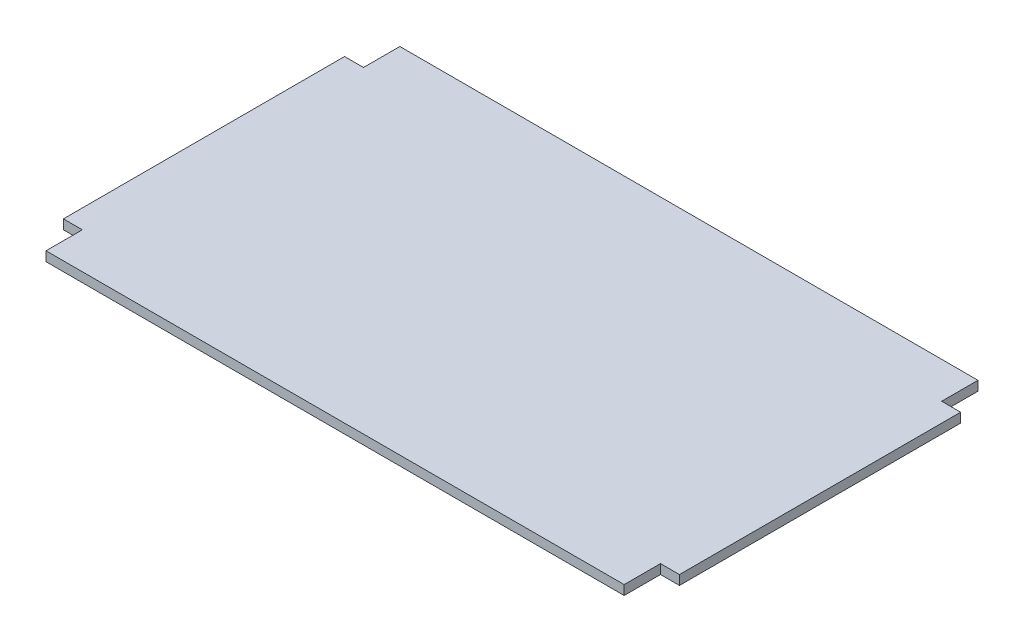
ISO-10303-21;
HEADER;
FILE_DESCRIPTION(('STEP AP214'),'2;1');
FILE_NAME('part.step','',(''),(''),'','','');
FILE_SCHEMA(('AUTOMOTIVE_DESIGN { 1 0 10303 214 1 1 1 1 }'));
ENDSEC;
DATA;
#1=APPLICATION_CONTEXT('core data for automotive mechanical design processes');
#2=APPLICATION_PROTOCOL_DEFINITION('international standard','automotive_design',2000,#1);
#3=PRODUCT_CONTEXT('',#1,'mechanical');
#4=PRODUCT('Part','Part','',(#3));
#5=PRODUCT_RELATED_PRODUCT_CATEGORY('part','',(#4));
#6=PRODUCT_DEFINITION_FORMATION('','',#4);
#7=PRODUCT_DEFINITION_CONTEXT('part definition',#1,'design');
#8=PRODUCT_DEFINITION('design','',#6,#7);
#9=PRODUCT_DEFINITION_SHAPE('','',#8);
#10=(LENGTH_UNIT() NAMED_UNIT(*) SI_UNIT(.MILLI.,.METRE.));
#11=(NAMED_UNIT(*) PLANE_ANGLE_UNIT() SI_UNIT($,.RADIAN.));
#12=(NAMED_UNIT(*) SI_UNIT($,.STERADIAN.) SOLID_ANGLE_UNIT());
#13=UNCERTAINTY_MEASURE_WITH_UNIT(LENGTH_MEASURE(1.E-05),#10,'distance_accuracy_value','');
#14=(GEOMETRIC_REPRESENTATION_CONTEXT(3) GLOBAL_UNCERTAINTY_ASSIGNED_CONTEXT((#13)) GLOBAL_UNIT_ASSIGNED_CONTEXT((#10,
#11,#12)) REPRESENTATION_CONTEXT('',''));
#15=CARTESIAN_POINT('',(0.,0.,0.));
#16=DIRECTION('',(0.,0.,1.));
#17=DIRECTION('',(1.,0.,0.));
#18=AXIS2_PLACEMENT_3D('',#15,#16,#17);
#19=CARTESIAN_POINT('',(1238.25,19.05,565.15));
#20=DIRECTION('',(0.,0.,-1.));
#21=DIRECTION('',(-1.,0.,0.));
#22=AXIS2_PLACEMENT_3D('',#19,#20,#21);
#23=PLANE('',#22);
#24=DIRECTION('',(1.,0.,0.));
#25=VECTOR('',#24,1.);
#26=CARTESIAN_POINT('',(1238.25,0.,565.15));
#27=LINE('',#26,#25);
#28=CARTESIAN_POINT('',(1200.15,0.,565.15));
#29=VERTEX_POINT('',#28);
#30=CARTESIAN_POINT('',(1238.25,0.,565.15));
#31=VERTEX_POINT('',#30);
#32=EDGE_CURVE('E164',#29,#31,#27,.T.);
#33=ORIENTED_EDGE('',*,*,#32,.T.);
#34=DIRECTION('',(0.,-1.,0.));
#35=VECTOR('',#34,1.);
#36=CARTESIAN_POINT('',(1238.25,19.05,565.15));
#37=LINE('',#36,#35);
#38=CARTESIAN_POINT('',(1238.25,19.05,565.15));
#39=VERTEX_POINT('',#38);
#40=EDGE_CURVE('E12',#39,#31,#37,.T.);
#41=ORIENTED_EDGE('',*,*,#40,.F.);
#42=DIRECTION('',(1.,0.,0.));
#43=VECTOR('',#42,1.);
#44=CARTESIAN_POINT('',(1238.25,19.05,565.15));
#45=LINE('',#44,#43);
#46=CARTESIAN_POINT('',(1200.15,19.05,565.15));
#47=VERTEX_POINT('',#46);
#48=EDGE_CURVE('E198',#47,#39,#45,.T.);
#49=ORIENTED_EDGE('',*,*,#48,.F.);
#50=DIRECTION('',(0.,-1.,0.));
#51=VECTOR('',#50,1.);
#52=CARTESIAN_POINT('',(1200.15,19.05,565.15));
#53=LINE('',#52,#51);
#54=EDGE_CURVE('E160',#47,#29,#53,.T.);
#55=ORIENTED_EDGE('',*,*,#54,.T.);
#56=EDGE_LOOP('',(#33,#41,#49,#55));
#57=FACE_BOUND('',#56,.T.);
#58=ADVANCED_FACE('F39',(#57),#23,.F.);
#59=CARTESIAN_POINT('',(1238.25,19.05,0.));
#60=DIRECTION('',(-1.,0.,0.));
#61=DIRECTION('',(0.,0.,1.));
#62=AXIS2_PLACEMENT_3D('',#59,#60,#61);
#63=PLANE('',#62);
#64=DIRECTION('',(0.,0.,-1.));
#65=VECTOR('',#64,1.);
#66=CARTESIAN_POINT('',(1238.25,0.,0.));
#67=LINE('',#66,#65);
#68=CARTESIAN_POINT('',(1238.25,0.,0.));
#69=VERTEX_POINT('',#68);
#70=EDGE_CURVE('E168',#31,#69,#67,.T.);
#71=ORIENTED_EDGE('',*,*,#70,.T.);
#72=DIRECTION('',(0.,-1.,0.));
#73=VECTOR('',#72,1.);
#74=CARTESIAN_POINT('',(1238.25,19.05,0.));
#75=LINE('',#74,#73);
#76=CARTESIAN_POINT('',(1238.25,19.05,0.));
#77=VERTEX_POINT('',#76);
#78=EDGE_CURVE('E48',#77,#69,#75,.T.);
#79=ORIENTED_EDGE('',*,*,#78,.F.);
#80=DIRECTION('',(0.,0.,-1.));
#81=VECTOR('',#80,1.);
#82=CARTESIAN_POINT('',(1238.25,19.05,0.));
#83=LINE('',#82,#81);
#84=EDGE_CURVE('E111',#39,#77,#83,.T.);
#85=ORIENTED_EDGE('',*,*,#84,.F.);
#86=ORIENTED_EDGE('',*,*,#40,.T.);
#87=EDGE_LOOP('',(#71,#79,#85,#86));
#88=FACE_BOUND('',#87,.T.);
#89=ADVANCED_FACE('F292',(#88),#63,.F.);
#90=CARTESIAN_POINT('',(1238.25,19.05,0.));
#91=DIRECTION('',(0.,0.,1.));
#92=DIRECTION('',(1.,0.,0.));
#93=AXIS2_PLACEMENT_3D('',#90,#91,#92);
#94=PLANE('',#93);
#95=DIRECTION('',(-1.,0.,0.));
#96=VECTOR('',#95,1.);
#97=CARTESIAN_POINT('',(1238.25,0.,0.));
#98=LINE('',#97,#96);
#99=CARTESIAN_POINT('',(1200.15,0.,0.));
#100=VERTEX_POINT('',#99);
#101=EDGE_CURVE('E171',#69,#100,#98,.T.);
#102=ORIENTED_EDGE('',*,*,#101,.T.);
#103=DIRECTION('',(0.,-1.,0.));
#104=VECTOR('',#103,1.);
#105=CARTESIAN_POINT('',(1200.15,19.05,0.));
#106=LINE('',#105,#104);
#107=CARTESIAN_POINT('',(1200.15,19.05,0.));
#108=VERTEX_POINT('',#107);
#109=EDGE_CURVE('E225',#108,#100,#106,.T.);
#110=ORIENTED_EDGE('',*,*,#109,.F.);
#111=DIRECTION('',(-1.,0.,0.));
#112=VECTOR('',#111,1.);
#113=CARTESIAN_POINT('',(1238.25,19.05,0.));
#114=LINE('',#113,#112);
#115=EDGE_CURVE('E235',#77,#108,#114,.T.);
#116=ORIENTED_EDGE('',*,*,#115,.F.);
#117=ORIENTED_EDGE('',*,*,#78,.T.);
#118=EDGE_LOOP('',(#102,#110,#116,#117));
#119=FACE_BOUND('',#118,.T.);
#120=ADVANCED_FACE('F233',(#119),#94,.F.);
#121=CARTESIAN_POINT('',(1200.15,19.05,0.));
#122=DIRECTION('',(-1.,0.,0.));
#123=DIRECTION('',(0.,0.,1.));
#124=AXIS2_PLACEMENT_3D('',#121,#122,#123);
#125=PLANE('',#124);
#126=DIRECTION('',(0.,0.,-1.));
#127=VECTOR('',#126,1.);
#128=CARTESIAN_POINT('',(1200.15,0.,0.));
#129=LINE('',#128,#127);
#130=CARTESIAN_POINT('',(1200.15,0.,-73.025));
#131=VERTEX_POINT('',#130);
#132=EDGE_CURVE('E174',#100,#131,#129,.T.);
#133=ORIENTED_EDGE('',*,*,#132,.T.);
#134=DIRECTION('',(0.,-1.,0.));
#135=VECTOR('',#134,1.);
#136=CARTESIAN_POINT('',(1200.15,19.05,-73.025));
#137=LINE('',#136,#135);
#138=CARTESIAN_POINT('',(1200.15,19.05,-73.025));
#139=VERTEX_POINT('',#138);
#140=EDGE_CURVE('E221',#139,#131,#137,.T.);
#141=ORIENTED_EDGE('',*,*,#140,.F.);
#142=DIRECTION('',(0.,0.,-1.));
#143=VECTOR('',#142,1.);
#144=CARTESIAN_POINT('',(1200.15,19.05,0.));
#145=LINE('',#144,#143);
#146=EDGE_CURVE('E254',#108,#139,#145,.T.);
#147=ORIENTED_EDGE('',*,*,#146,.F.);
#148=ORIENTED_EDGE('',*,*,#109,.T.);
#149=EDGE_LOOP('',(#133,#141,#147,#148));
#150=FACE_BOUND('',#149,.T.);
#151=ADVANCED_FACE('F244',(#150),#125,.F.);
#152=CARTESIAN_POINT('',(38.1,19.05,-73.025));
#153=DIRECTION('',(0.,0.,1.));
#154=DIRECTION('',(1.,0.,0.));
#155=AXIS2_PLACEMENT_3D('',#152,#153,#154);
#156=PLANE('',#155);
#157=DIRECTION('',(-1.,0.,0.));
#158=VECTOR('',#157,1.);
#159=CARTESIAN_POINT('',(38.1,0.,-73.025));
#160=LINE('',#159,#158);
#161=CARTESIAN_POINT('',(38.1,0.,-73.025));
#162=VERTEX_POINT('',#161);
#163=EDGE_CURVE('E177',#131,#162,#160,.T.);
#164=ORIENTED_EDGE('',*,*,#163,.T.);
#165=DIRECTION('',(0.,-1.,0.));
#166=VECTOR('',#165,1.);
#167=CARTESIAN_POINT('',(38.1,19.05,-73.025));
#168=LINE('',#167,#166);
#169=CARTESIAN_POINT('',(38.1,19.05,-73.025));
#170=VERTEX_POINT('',#169);
#171=EDGE_CURVE('E217',#170,#162,#168,.T.);
#172=ORIENTED_EDGE('',*,*,#171,.F.);
#173=DIRECTION('',(-1.,0.,0.));
#174=VECTOR('',#173,1.);
#175=CARTESIAN_POINT('',(38.1,19.05,-73.025));
#176=LINE('',#175,#174);
#177=EDGE_CURVE('E250',#139,#170,#176,.T.);
#178=ORIENTED_EDGE('',*,*,#177,.F.);
#179=ORIENTED_EDGE('',*,*,#140,.T.);
#180=EDGE_LOOP('',(#164,#172,#178,#179));
#181=FACE_BOUND('',#180,.T.);
#182=ADVANCED_FACE('F248',(#181),#156,.F.);
#183=CARTESIAN_POINT('',(38.1,19.05,0.));
#184=DIRECTION('',(1.,0.,0.));
#185=DIRECTION('',(0.,0.,-1.));
#186=AXIS2_PLACEMENT_3D('',#183,#184,#185);
#187=PLANE('',#186);
#188=DIRECTION('',(0.,0.,1.));
#189=VECTOR('',#188,1.);
#190=CARTESIAN_POINT('',(38.1,0.,0.));
#191=LINE('',#190,#189);
#192=CARTESIAN_POINT('',(38.1,0.,0.));
#193=VERTEX_POINT('',#192);
#194=EDGE_CURVE('E180',#162,#193,#191,.T.);
#195=ORIENTED_EDGE('',*,*,#194,.T.);
#196=DIRECTION('',(0.,-1.,0.));
#197=VECTOR('',#196,1.);
#198=CARTESIAN_POINT('',(38.1,19.05,0.));
#199=LINE('',#198,#197);
#200=CARTESIAN_POINT('',(38.1,19.05,0.));
#201=VERTEX_POINT('',#200);
#202=EDGE_CURVE('E213',#201,#193,#199,.T.);
#203=ORIENTED_EDGE('',*,*,#202,.F.);
#204=DIRECTION('',(0.,0.,1.));
#205=VECTOR('',#204,1.);
#206=CARTESIAN_POINT('',(38.1,19.05,0.));
#207=LINE('',#206,#205);
#208=EDGE_CURVE('E253',#170,#201,#207,.T.);
#209=ORIENTED_EDGE('',*,*,#208,.F.);
#210=ORIENTED_EDGE('',*,*,#171,.T.);
#211=EDGE_LOOP('',(#195,#203,#209,#210));
#212=FACE_BOUND('',#211,.T.);
#213=ADVANCED_FACE('F305',(#212),#187,.F.);
#214=CARTESIAN_POINT('',(0.,19.05,0.));
#215=DIRECTION('',(0.,0.,1.));
#216=DIRECTION('',(1.,0.,0.));
#217=AXIS2_PLACEMENT_3D('',#214,#215,#216);
#218=PLANE('',#217);
#219=DIRECTION('',(-1.,0.,0.));
#220=VECTOR('',#219,1.);
#221=CARTESIAN_POINT('',(0.,0.,0.));
#222=LINE('',#221,#220);
#223=CARTESIAN_POINT('',(0.,0.,0.));
#224=VERTEX_POINT('',#223);
#225=EDGE_CURVE('E183',#193,#224,#222,.T.);
#226=ORIENTED_EDGE('',*,*,#225,.T.);
#227=DIRECTION('',(0.,-1.,0.));
#228=VECTOR('',#227,1.);
#229=CARTESIAN_POINT('',(0.,19.05,0.));
#230=LINE('',#229,#228);
#231=CARTESIAN_POINT('',(0.,19.05,0.));
#232=VERTEX_POINT('',#231);
#233=EDGE_CURVE('E209',#232,#224,#230,.T.);
#234=ORIENTED_EDGE('',*,*,#233,.F.);
#235=DIRECTION('',(-1.,0.,0.));
#236=VECTOR('',#235,1.);
#237=CARTESIAN_POINT('',(0.,19.05,0.));
#238=LINE('',#237,#236);
#239=EDGE_CURVE('E258',#201,#232,#238,.T.);
#240=ORIENTED_EDGE('',*,*,#239,.F.);
#241=ORIENTED_EDGE('',*,*,#202,.T.);
#242=EDGE_LOOP('',(#226,#234,#240,#241));
#243=FACE_BOUND('',#242,.T.);
#244=ADVANCED_FACE('F308',(#243),#218,.F.);
#245=CARTESIAN_POINT('',(0.,19.05,0.));
#246=DIRECTION('',(1.,0.,0.));
#247=DIRECTION('',(0.,0.,-1.));
#248=AXIS2_PLACEMENT_3D('',#245,#246,#247);
#249=PLANE('',#248);
#250=DIRECTION('',(0.,0.,1.));
#251=VECTOR('',#250,1.);
#252=CARTESIAN_POINT('',(0.,0.,0.));
#253=LINE('',#252,#251);
#254=CARTESIAN_POINT('',(0.,0.,565.15));
#255=VERTEX_POINT('',#254);
#256=EDGE_CURVE('E186',#224,#255,#253,.T.);
#257=ORIENTED_EDGE('',*,*,#256,.T.);
#258=DIRECTION('',(0.,-1.,0.));
#259=VECTOR('',#258,1.);
#260=CARTESIAN_POINT('',(0.,19.05,565.15));
#261=LINE('',#260,#259);
#262=CARTESIAN_POINT('',(0.,19.05,565.15));
#263=VERTEX_POINT('',#262);
#264=EDGE_CURVE('E205',#263,#255,#261,.T.);
#265=ORIENTED_EDGE('',*,*,#264,.F.);
#266=DIRECTION('',(0.,0.,1.));
#267=VECTOR('',#266,1.);
#268=CARTESIAN_POINT('',(0.,19.05,0.));
#269=LINE('',#268,#267);
#270=EDGE_CURVE('E265',#232,#263,#269,.T.);
#271=ORIENTED_EDGE('',*,*,#270,.F.);
#272=ORIENTED_EDGE('',*,*,#233,.T.);
#273=EDGE_LOOP('',(#257,#265,#271,#272));
#274=FACE_BOUND('',#273,.T.);
#275=ADVANCED_FACE('F273',(#274),#249,.F.);
#276=CARTESIAN_POINT('',(38.1000000000001,19.05,565.15));
#277=DIRECTION('',(0.,0.,-1.));
#278=DIRECTION('',(-1.,0.,0.));
#279=AXIS2_PLACEMENT_3D('',#276,#277,#278);
#280=PLANE('',#279);
#281=DIRECTION('',(1.,0.,0.));
#282=VECTOR('',#281,1.);
#283=CARTESIAN_POINT('',(38.1000000000001,0.,565.15));
#284=LINE('',#283,#282);
#285=CARTESIAN_POINT('',(38.1000000000001,0.,565.15));
#286=VERTEX_POINT('',#285);
#287=EDGE_CURVE('E189',#255,#286,#284,.T.);
#288=ORIENTED_EDGE('',*,*,#287,.T.);
#289=DIRECTION('',(0.,-1.,0.));
#290=VECTOR('',#289,1.);
#291=CARTESIAN_POINT('',(38.1000000000001,19.05,565.15));
#292=LINE('',#291,#290);
#293=CARTESIAN_POINT('',(38.1000000000001,19.05,565.15));
#294=VERTEX_POINT('',#293);
#295=EDGE_CURVE('E153',#294,#286,#292,.T.);
#296=ORIENTED_EDGE('',*,*,#295,.F.);
#297=DIRECTION('',(1.,0.,0.));
#298=VECTOR('',#297,1.);
#299=CARTESIAN_POINT('',(38.1000000000001,19.05,565.15));
#300=LINE('',#299,#298);
#301=EDGE_CURVE('E142',#263,#294,#300,.T.);
#302=ORIENTED_EDGE('',*,*,#301,.F.);
#303=ORIENTED_EDGE('',*,*,#264,.T.);
#304=EDGE_LOOP('',(#288,#296,#302,#303));
#305=FACE_BOUND('',#304,.T.);
#306=ADVANCED_FACE('F277',(#305),#280,.F.);
#307=CARTESIAN_POINT('',(38.1000000000001,19.05,638.175));
#308=DIRECTION('',(1.,0.,0.));
#309=DIRECTION('',(0.,0.,-1.));
#310=AXIS2_PLACEMENT_3D('',#307,#308,#309);
#311=PLANE('',#310);
#312=DIRECTION('',(0.,0.,1.));
#313=VECTOR('',#312,1.);
#314=CARTESIAN_POINT('',(38.1000000000001,0.,638.175));
#315=LINE('',#314,#313);
#316=CARTESIAN_POINT('',(38.1000000000001,0.,638.175));
#317=VERTEX_POINT('',#316);
#318=EDGE_CURVE('E151',#286,#317,#315,.T.);
#319=ORIENTED_EDGE('',*,*,#318,.T.);
#320=DIRECTION('',(0.,-1.,0.));
#321=VECTOR('',#320,1.);
#322=CARTESIAN_POINT('',(38.1000000000001,19.05,638.175));
#323=LINE('',#322,#321);
#324=CARTESIAN_POINT('',(38.1000000000001,19.05,638.175));
#325=VERTEX_POINT('',#324);
#326=EDGE_CURVE('E148',#325,#317,#323,.T.);
#327=ORIENTED_EDGE('',*,*,#326,.F.);
#328=DIRECTION('',(0.,0.,1.));
#329=VECTOR('',#328,1.);
#330=CARTESIAN_POINT('',(38.1000000000001,19.05,638.175));
#331=LINE('',#330,#329);
#332=EDGE_CURVE('E136',#294,#325,#331,.T.);
#333=ORIENTED_EDGE('',*,*,#332,.F.);
#334=ORIENTED_EDGE('',*,*,#295,.T.);
#335=EDGE_LOOP('',(#319,#327,#333,#334));
#336=FACE_BOUND('',#335,.T.);
#337=ADVANCED_FACE('F149',(#336),#311,.F.);
#338=CARTESIAN_POINT('',(38.1000000000001,19.05,638.175));
#339=DIRECTION('',(0.,0.,-1.));
#340=DIRECTION('',(-1.,0.,0.));
#341=AXIS2_PLACEMENT_3D('',#338,#339,#340);
#342=PLANE('',#341);
#343=DIRECTION('',(1.,0.,0.));
#344=VECTOR('',#343,1.);
#345=CARTESIAN_POINT('',(38.1000000000001,0.,638.175));
#346=LINE('',#345,#344);
#347=CARTESIAN_POINT('',(1200.15,0.,638.175));
#348=VERTEX_POINT('',#347);
#349=EDGE_CURVE('E97',#317,#348,#346,.T.);
#350=ORIENTED_EDGE('',*,*,#349,.T.);
#351=DIRECTION('',(0.,-1.,0.));
#352=VECTOR('',#351,1.);
#353=CARTESIAN_POINT('',(1200.15,19.05,638.175));
#354=LINE('',#353,#352);
#355=CARTESIAN_POINT('',(1200.15,19.05,638.175));
#356=VERTEX_POINT('',#355);
#357=EDGE_CURVE('E154',#356,#348,#354,.T.);
#358=ORIENTED_EDGE('',*,*,#357,.F.);
#359=DIRECTION('',(1.,0.,0.));
#360=VECTOR('',#359,1.);
#361=CARTESIAN_POINT('',(38.1000000000001,19.05,638.175));
#362=LINE('',#361,#360);
#363=EDGE_CURVE('E140',#325,#356,#362,.T.);
#364=ORIENTED_EDGE('',*,*,#363,.F.);
#365=ORIENTED_EDGE('',*,*,#326,.T.);
#366=EDGE_LOOP('',(#350,#358,#364,#365));
#367=FACE_BOUND('',#366,.T.);
#368=ADVANCED_FACE('F156',(#367),#342,.F.);
#369=CARTESIAN_POINT('',(1200.15,19.05,565.15));
#370=DIRECTION('',(-1.,0.,0.));
#371=DIRECTION('',(0.,0.,1.));
#372=AXIS2_PLACEMENT_3D('',#369,#370,#371);
#373=PLANE('',#372);
#374=DIRECTION('',(0.,0.,-1.));
#375=VECTOR('',#374,1.);
#376=CARTESIAN_POINT('',(1200.15,0.,565.15));
#377=LINE('',#376,#375);
#378=EDGE_CURVE('E103',#348,#29,#377,.T.);
#379=ORIENTED_EDGE('',*,*,#378,.T.);
#380=ORIENTED_EDGE('',*,*,#54,.F.);
#381=DIRECTION('',(0.,0.,-1.));
#382=VECTOR('',#381,1.);
#383=CARTESIAN_POINT('',(1200.15,19.05,565.15));
#384=LINE('',#383,#382);
#385=EDGE_CURVE('E56',#356,#47,#384,.T.);
#386=ORIENTED_EDGE('',*,*,#385,.F.);
#387=ORIENTED_EDGE('',*,*,#357,.T.);
#388=EDGE_LOOP('',(#379,#380,#386,#387));
#389=FACE_BOUND('',#388,.T.);
#390=ADVANCED_FACE('F281',(#389),#373,.F.);
#391=CARTESIAN_POINT('',(0.,19.05,0.));
#392=DIRECTION('',(0.,1.,0.));
#393=DIRECTION('',(0.,0.,1.));
#394=AXIS2_PLACEMENT_3D('',#391,#392,#393);
#395=PLANE('',#394);
#396=ORIENTED_EDGE('',*,*,#48,.T.);
#397=ORIENTED_EDGE('',*,*,#84,.T.);
#398=ORIENTED_EDGE('',*,*,#115,.T.);
#399=ORIENTED_EDGE('',*,*,#146,.T.);
#400=ORIENTED_EDGE('',*,*,#177,.T.);
#401=ORIENTED_EDGE('',*,*,#208,.T.);
#402=ORIENTED_EDGE('',*,*,#239,.T.);
#403=ORIENTED_EDGE('',*,*,#270,.T.);
#404=ORIENTED_EDGE('',*,*,#301,.T.);
#405=ORIENTED_EDGE('',*,*,#332,.T.);
#406=ORIENTED_EDGE('',*,*,#363,.T.);
#407=ORIENTED_EDGE('',*,*,#385,.T.);
#408=EDGE_LOOP('',(#396,#397,#398,#399,#400,#401,#402,#403,#404,#405,#406,#407));
#409=FACE_BOUND('',#408,.T.);
#410=ADVANCED_FACE('F138',(#409),#395,.T.);
#411=CARTESIAN_POINT('',(0.,0.,0.));
#412=DIRECTION('',(0.,1.,0.));
#413=DIRECTION('',(0.,0.,1.));
#414=AXIS2_PLACEMENT_3D('',#411,#412,#413);
#415=PLANE('',#414);
#416=ORIENTED_EDGE('',*,*,#32,.F.);
#417=ORIENTED_EDGE('',*,*,#378,.F.);
#418=ORIENTED_EDGE('',*,*,#349,.F.);
#419=ORIENTED_EDGE('',*,*,#318,.F.);
#420=ORIENTED_EDGE('',*,*,#287,.F.);
#421=ORIENTED_EDGE('',*,*,#256,.F.);
#422=ORIENTED_EDGE('',*,*,#225,.F.);
#423=ORIENTED_EDGE('',*,*,#194,.F.);
#424=ORIENTED_EDGE('',*,*,#163,.F.);
#425=ORIENTED_EDGE('',*,*,#132,.F.);
#426=ORIENTED_EDGE('',*,*,#101,.F.);
#427=ORIENTED_EDGE('',*,*,#70,.F.);
#428=EDGE_LOOP('',(#416,#417,#418,#419,#420,#421,#422,#423,#424,#425,#426,#427));
#429=FACE_BOUND('',#428,.T.);
#430=ADVANCED_FACE('F239',(#429),#415,.F.);
#431=CLOSED_SHELL('',(#58,#89,#120,#151,#182,#213,#244,#275,#306,#337,#368,#390,#410,#430));
#432=MANIFOLD_SOLID_BREP('B2',#431);
#433=ADVANCED_BREP_SHAPE_REPRESENTATION('',(#18,#432),#14);
#434=SHAPE_DEFINITION_REPRESENTATION(#9,#433);
ENDSEC;
END-ISO-10303-21;
